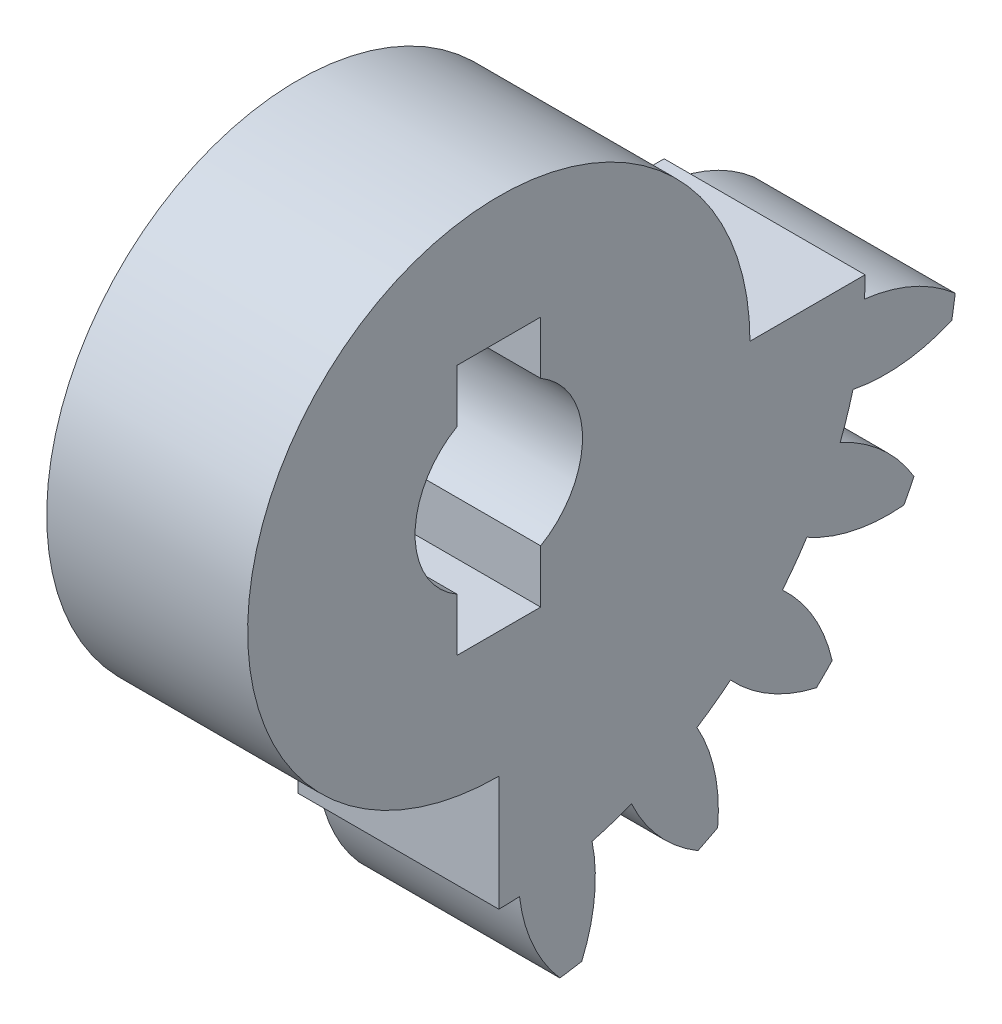
ISO-10303-21;
HEADER;
FILE_DESCRIPTION(('STEP AP214'),'2;1');
FILE_NAME('part.step','',(''),(''),'','','');
FILE_SCHEMA(('AUTOMOTIVE_DESIGN { 1 0 10303 214 1 1 1 1 }'));
ENDSEC;
DATA;
#1=APPLICATION_CONTEXT('core data for automotive mechanical design processes');
#2=APPLICATION_PROTOCOL_DEFINITION('international standard','automotive_design',2000,#1);
#3=PRODUCT_CONTEXT('',#1,'mechanical');
#4=PRODUCT('Part','Part','',(#3));
#5=PRODUCT_RELATED_PRODUCT_CATEGORY('part','',(#4));
#6=PRODUCT_DEFINITION_FORMATION('','',#4);
#7=PRODUCT_DEFINITION_CONTEXT('part definition',#1,'design');
#8=PRODUCT_DEFINITION('design','',#6,#7);
#9=PRODUCT_DEFINITION_SHAPE('','',#8);
#10=(LENGTH_UNIT() NAMED_UNIT(*) SI_UNIT(.MILLI.,.METRE.));
#11=(NAMED_UNIT(*) PLANE_ANGLE_UNIT() SI_UNIT($,.RADIAN.));
#12=(NAMED_UNIT(*) SI_UNIT($,.STERADIAN.) SOLID_ANGLE_UNIT());
#13=UNCERTAINTY_MEASURE_WITH_UNIT(LENGTH_MEASURE(1.E-05),#10,'distance_accuracy_value','');
#14=(GEOMETRIC_REPRESENTATION_CONTEXT(3) GLOBAL_UNCERTAINTY_ASSIGNED_CONTEXT((#13)) GLOBAL_UNIT_ASSIGNED_CONTEXT((#10,
#11,#12)) REPRESENTATION_CONTEXT('',''));
#15=CARTESIAN_POINT('',(0.,0.,0.));
#16=DIRECTION('',(0.,0.,1.));
#17=DIRECTION('',(1.,0.,0.));
#18=AXIS2_PLACEMENT_3D('',#15,#16,#17);
#19=CARTESIAN_POINT('',(-10.,0.,0.));
#20=DIRECTION('',(1.,0.,0.));
#21=DIRECTION('',(0.,0.,-1.));
#22=AXIS2_PLACEMENT_3D('',#19,#20,#21);
#23=CYLINDRICAL_SURFACE('',#22,5.);
#24=CARTESIAN_POINT('',(12.,0.,0.));
#25=DIRECTION('',(1.,0.,0.));
#26=DIRECTION('',(0.,0.,-1.));
#27=AXIS2_PLACEMENT_3D('',#24,#25,#26);
#28=CIRCLE('',#27,5.);
#29=CARTESIAN_POINT('',(12.,-4.33012701892219,-2.5));
#30=VERTEX_POINT('',#29);
#31=CARTESIAN_POINT('',(12.,4.33012701892219,-2.5));
#32=VERTEX_POINT('',#31);
#33=EDGE_CURVE('E268',#30,#32,#28,.T.);
#34=ORIENTED_EDGE('',*,*,#33,.T.);
#35=DIRECTION('',(1.,0.,0.));
#36=VECTOR('',#35,1.);
#37=CARTESIAN_POINT('',(-10.,4.33012701892219,-2.5));
#38=LINE('',#37,#36);
#39=CARTESIAN_POINT('',(0.,4.33012701892219,-2.5));
#40=VERTEX_POINT('',#39);
#41=EDGE_CURVE('E269',#32,#40,#38,.F.);
#42=ORIENTED_EDGE('',*,*,#41,.T.);
#43=CARTESIAN_POINT('',(0.,0.,0.));
#44=DIRECTION('',(1.,0.,0.));
#45=DIRECTION('',(0.,0.,-1.));
#46=AXIS2_PLACEMENT_3D('',#43,#44,#45);
#47=CIRCLE('',#46,5.);
#48=CARTESIAN_POINT('',(0.,-4.33012701892219,-2.5));
#49=VERTEX_POINT('',#48);
#50=EDGE_CURVE('E284',#49,#40,#47,.T.);
#51=ORIENTED_EDGE('',*,*,#50,.F.);
#52=DIRECTION('',(1.,0.,0.));
#53=VECTOR('',#52,1.);
#54=CARTESIAN_POINT('',(-10.,-4.33012701892219,-2.5));
#55=LINE('',#54,#53);
#56=EDGE_CURVE('E272',#49,#30,#55,.T.);
#57=ORIENTED_EDGE('',*,*,#56,.T.);
#58=EDGE_LOOP('',(#34,#42,#51,#57));
#59=FACE_BOUND('',#58,.T.);
#60=ADVANCED_FACE('F38',(#59),#23,.F.);
#61=CARTESIAN_POINT('',(12.,0.,0.));
#62=DIRECTION('',(-1.,0.,0.));
#63=DIRECTION('',(0.,0.,1.));
#64=AXIS2_PLACEMENT_3D('',#61,#62,#63);
#65=PLANE('',#64);
#66=DIRECTION('',(0.,0.,-1.));
#67=VECTOR('',#66,1.);
#68=CARTESIAN_POINT('',(12.,7.5,0.));
#69=LINE('',#68,#67);
#70=CARTESIAN_POINT('',(12.,7.5,2.5));
#71=VERTEX_POINT('',#70);
#72=CARTESIAN_POINT('',(12.,7.5,-2.5));
#73=VERTEX_POINT('',#72);
#74=EDGE_CURVE('E275',#71,#73,#69,.T.);
#75=ORIENTED_EDGE('',*,*,#74,.T.);
#76=DIRECTION('',(0.,-1.,0.));
#77=VECTOR('',#76,1.);
#78=CARTESIAN_POINT('',(12.,0.,-2.5));
#79=LINE('',#78,#77);
#80=EDGE_CURVE('E417',#73,#32,#79,.T.);
#81=ORIENTED_EDGE('',*,*,#80,.T.);
#82=ORIENTED_EDGE('',*,*,#33,.F.);
#83=CARTESIAN_POINT('',(12.,-7.5,-2.5));
#84=VERTEX_POINT('',#83);
#85=EDGE_CURVE('E422',#30,#84,#79,.T.);
#86=ORIENTED_EDGE('',*,*,#85,.T.);
#87=DIRECTION('',(0.,0.,1.));
#88=VECTOR('',#87,1.);
#89=CARTESIAN_POINT('',(12.,-7.5,0.));
#90=LINE('',#89,#88);
#91=CARTESIAN_POINT('',(12.,-7.5,2.5));
#92=VERTEX_POINT('',#91);
#93=EDGE_CURVE('E418',#84,#92,#90,.T.);
#94=ORIENTED_EDGE('',*,*,#93,.T.);
#95=DIRECTION('',(0.,1.,0.));
#96=VECTOR('',#95,1.);
#97=CARTESIAN_POINT('',(12.,0.,2.5));
#98=LINE('',#97,#96);
#99=CARTESIAN_POINT('',(12.,-4.33012701892219,2.5));
#100=VERTEX_POINT('',#99);
#101=EDGE_CURVE('E421',#92,#100,#98,.T.);
#102=ORIENTED_EDGE('',*,*,#101,.T.);
#103=CARTESIAN_POINT('',(12.,4.33012701892219,2.5));
#104=VERTEX_POINT('',#103);
#105=EDGE_CURVE('E280',#104,#100,#28,.T.);
#106=ORIENTED_EDGE('',*,*,#105,.F.);
#107=EDGE_CURVE('E425',#104,#71,#98,.T.);
#108=ORIENTED_EDGE('',*,*,#107,.T.);
#109=EDGE_LOOP('',(#75,#81,#82,#86,#94,#102,#106,#108));
#110=FACE_BOUND('',#109,.T.);
#111=DIRECTION('',(0.,0.,1.));
#112=VECTOR('',#111,1.);
#113=CARTESIAN_POINT('',(12.,0.,0.));
#114=LINE('',#113,#112);
#115=CARTESIAN_POINT('',(12.,0.,-21.874));
#116=VERTEX_POINT('',#115);
#117=CARTESIAN_POINT('',(12.,0.,-15.));
#118=VERTEX_POINT('',#117);
#119=EDGE_CURVE('E253',#116,#118,#114,.T.);
#120=ORIENTED_EDGE('',*,*,#119,.T.);
#121=CARTESIAN_POINT('',(12.,0.,0.));
#122=DIRECTION('',(-1.,0.,0.));
#123=DIRECTION('',(0.,0.,1.));
#124=AXIS2_PLACEMENT_3D('',#121,#122,#123);
#125=CIRCLE('',#124,15.);
#126=CARTESIAN_POINT('',(12.,-15.,0.));
#127=VERTEX_POINT('',#126);
#128=EDGE_CURVE('E252',#118,#127,#125,.F.);
#129=ORIENTED_EDGE('',*,*,#128,.T.);
#130=DIRECTION('',(0.,-1.,0.));
#131=VECTOR('',#130,1.);
#132=CARTESIAN_POINT('',(12.,0.,0.));
#133=LINE('',#132,#131);
#134=CARTESIAN_POINT('',(12.,-21.874,0.));
#135=VERTEX_POINT('',#134);
#136=EDGE_CURVE('E428',#127,#135,#133,.T.);
#137=ORIENTED_EDGE('',*,*,#136,.T.);
#138=CARTESIAN_POINT('',(12.,0.,0.));
#139=DIRECTION('',(-1.,0.,0.));
#140=DIRECTION('',(0.,0.,1.));
#141=AXIS2_PLACEMENT_3D('',#138,#139,#140);
#142=CIRCLE('',#141,21.874);
#143=CARTESIAN_POINT('',(12.,-21.8389540079858,-1.23772526720575));
#144=VERTEX_POINT('',#143);
#145=EDGE_CURVE('E409',#144,#135,#142,.T.);
#146=ORIENTED_EDGE('',*,*,#145,.F.);
#147=CARTESIAN_POINT('',(12.,-20.6674910859764,-11.168871959424));
#148=DIRECTION('',(-1.,0.,0.));
#149=DIRECTION('',(0.,0.,1.));
#150=AXIS2_PLACEMENT_3D('',#147,#148,#149);
#151=CIRCLE('',#150,10.);
#152=CARTESIAN_POINT('',(12.,-27.2570862348367,-3.64708787756433));
#153=VERTEX_POINT('',#152);
#154=EDGE_CURVE('E310',#153,#144,#151,.T.);
#155=ORIENTED_EDGE('',*,*,#154,.F.);
#156=CARTESIAN_POINT('',(12.,0.,0.));
#157=DIRECTION('',(-1.,0.,0.));
#158=DIRECTION('',(0.,0.,1.));
#159=AXIS2_PLACEMENT_3D('',#156,#157,#158);
#160=CIRCLE('',#159,27.5);
#161=CARTESIAN_POINT('',(12.,-27.0500416130065,-4.95431617224976));
#162=VERTEX_POINT('',#161);
#163=EDGE_CURVE('E450',#162,#153,#160,.T.);
#164=ORIENTED_EDGE('',*,*,#163,.F.);
#165=CARTESIAN_POINT('',(12.,-23.1073233162498,4.23562248001661));
#166=DIRECTION('',(-1.,0.,0.));
#167=DIRECTION('',(0.,-0.309016994374955,0.951056516295151));
#168=AXIS2_PLACEMENT_3D('',#165,#166,#167);
#169=CIRCLE('',#168,10.);
#170=CARTESIAN_POINT('',(12.,-21.1525576602989,-5.57146124708161));
#171=VERTEX_POINT('',#170);
#172=EDGE_CURVE('E328',#171,#162,#169,.T.);
#173=ORIENTED_EDGE('',*,*,#172,.F.);
#174=CARTESIAN_POINT('',(12.,0.,0.));
#175=DIRECTION('',(-1.,0.,0.));
#176=DIRECTION('',(0.,-0.309016994374955,0.951056516295151));
#177=AXIS2_PLACEMENT_3D('',#174,#175,#176);
#178=CIRCLE('',#177,21.874);
#179=CARTESIAN_POINT('',(12.,-20.3876013764312,-7.9257546085997));
#180=VERTEX_POINT('',#179);
#181=EDGE_CURVE('E302',#180,#171,#178,.T.);
#182=ORIENTED_EDGE('',*,*,#181,.F.);
#183=CARTESIAN_POINT('',(12.,-16.20458082933,-17.0088344333359));
#184=DIRECTION('',(-1.,0.,0.));
#185=DIRECTION('',(0.,-0.309016994374955,0.951056516295151));
#186=AXIS2_PLACEMENT_3D('',#183,#184,#185);
#187=CIRCLE('',#186,10.);
#188=CARTESIAN_POINT('',(12.,-24.7960173447141,-11.8914895551666));
#189=VERTEX_POINT('',#188);
#190=EDGE_CURVE('E332',#189,#180,#187,.T.);
#191=ORIENTED_EDGE('',*,*,#190,.F.);
#192=CARTESIAN_POINT('',(12.,-24.1951504493731,-13.0707572363732));
#193=VERTEX_POINT('',#192);
#194=EDGE_CURVE('E288',#193,#189,#160,.T.);
#195=ORIENTED_EDGE('',*,*,#194,.F.);
#196=CARTESIAN_POINT('',(12.,-23.28524974214,-3.11223923905164));
#197=DIRECTION('',(-1.,0.,0.));
#198=DIRECTION('',(0.,-0.58778525229248,0.809016994374942));
#199=AXIS2_PLACEMENT_3D('',#196,#197,#198);
#200=CIRCLE('',#199,10.);
#201=CARTESIAN_POINT('',(12.,-18.3956015902865,-11.8352743158512));
#202=VERTEX_POINT('',#201);
#203=EDGE_CURVE('E335',#202,#193,#200,.T.);
#204=ORIENTED_EDGE('',*,*,#203,.F.);
#205=CARTESIAN_POINT('',(12.,0.,0.));
#206=DIRECTION('',(-1.,0.,0.));
#207=DIRECTION('',(0.,-0.58778525229248,0.809016994374942));
#208=AXIS2_PLACEMENT_3D('',#205,#206,#207);
#209=CIRCLE('',#208,21.874);
#210=CARTESIAN_POINT('',(12.,-16.9405682733801,-13.8379558669244));
#211=VERTEX_POINT('',#210);
#212=EDGE_CURVE('E306',#211,#202,#209,.T.);
#213=ORIENTED_EDGE('',*,*,#212,.F.);
#214=CARTESIAN_POINT('',(12.,-10.1554532971553,-21.1838536853949));
#215=DIRECTION('',(-1.,0.,0.));
#216=DIRECTION('',(0.,-0.58778525229248,0.809016994374942));
#217=AXIS2_PLACEMENT_3D('',#214,#215,#216);
#218=CIRCLE('',#217,10.);
#219=CARTESIAN_POINT('',(12.,-19.9077415128793,-18.9718693822296));
#220=VERTEX_POINT('',#219);
#221=EDGE_CURVE('E339',#220,#211,#218,.T.);
#222=ORIENTED_EDGE('',*,*,#221,.F.);
#223=CARTESIAN_POINT('',(12.,-18.9718693822293,-19.9077415128797));
#224=VERTEX_POINT('',#223);
#225=EDGE_CURVE('E456',#224,#220,#160,.T.);
#226=ORIENTED_EDGE('',*,*,#225,.F.);
#227=CARTESIAN_POINT('',(12.,-21.1838536853947,-10.1554532971557));
#228=DIRECTION('',(-1.,0.,0.));
#229=DIRECTION('',(0.,-0.809016994374953,0.587785252292465));
#230=AXIS2_PLACEMENT_3D('',#227,#228,#229);
#231=CIRCLE('',#230,10.);
#232=CARTESIAN_POINT('',(12.,-13.8379558669241,-16.9405682733803));
#233=VERTEX_POINT('',#232);
#234=EDGE_CURVE('E314',#233,#224,#231,.T.);
#235=ORIENTED_EDGE('',*,*,#234,.F.);
#236=CARTESIAN_POINT('',(12.,0.,0.));
#237=DIRECTION('',(-1.,0.,0.));
#238=DIRECTION('',(0.,-0.809016994374953,0.587785252292465));
#239=AXIS2_PLACEMENT_3D('',#236,#237,#238);
#240=CIRCLE('',#239,21.874);
#241=CARTESIAN_POINT('',(12.,-11.8352743158509,-18.3956015902867));
#242=VERTEX_POINT('',#241);
#243=EDGE_CURVE('E294',#242,#233,#240,.T.);
#244=ORIENTED_EDGE('',*,*,#243,.F.);
#245=CARTESIAN_POINT('',(12.,-3.11223923905121,-23.28524974214));
#246=DIRECTION('',(-1.,0.,0.));
#247=DIRECTION('',(0.,-0.809016994374953,0.587785252292465));
#248=AXIS2_PLACEMENT_3D('',#245,#246,#247);
#249=CIRCLE('',#248,10.);
#250=CARTESIAN_POINT('',(12.,-13.0707572363727,-24.1951504493733));
#251=VERTEX_POINT('',#250);
#252=EDGE_CURVE('E318',#251,#242,#249,.T.);
#253=ORIENTED_EDGE('',*,*,#252,.F.);
#254=CARTESIAN_POINT('',(12.,-11.8914895551662,-24.7960173447143));
#255=VERTEX_POINT('',#254);
#256=EDGE_CURVE('E463',#255,#251,#160,.T.);
#257=ORIENTED_EDGE('',*,*,#256,.F.);
#258=CARTESIAN_POINT('',(12.,-17.0088344333356,-16.2045808293303));
#259=DIRECTION('',(-1.,0.,0.));
#260=DIRECTION('',(0.,-0.951056516295157,0.309016994374938));
#261=AXIS2_PLACEMENT_3D('',#258,#259,#260);
#262=CIRCLE('',#261,10.);
#263=CARTESIAN_POINT('',(12.,-7.92575460859934,-20.3876013764314));
#264=VERTEX_POINT('',#263);
#265=EDGE_CURVE('E321',#264,#255,#262,.T.);
#266=ORIENTED_EDGE('',*,*,#265,.F.);
#267=CARTESIAN_POINT('',(12.,0.,0.));
#268=DIRECTION('',(-1.,0.,0.));
#269=DIRECTION('',(0.,-0.951056516295157,0.309016994374938));
#270=AXIS2_PLACEMENT_3D('',#267,#268,#269);
#271=CIRCLE('',#270,21.874);
#272=CARTESIAN_POINT('',(12.,-5.57146124708125,-21.1525576602989));
#273=VERTEX_POINT('',#272);
#274=EDGE_CURVE('E298',#273,#264,#271,.T.);
#275=ORIENTED_EDGE('',*,*,#274,.F.);
#276=CARTESIAN_POINT('',(12.,4.23562248001701,-23.1073233162497));
#277=DIRECTION('',(-1.,0.,0.));
#278=DIRECTION('',(0.,-0.951056516295157,0.309016994374938));
#279=AXIS2_PLACEMENT_3D('',#276,#277,#278);
#280=CIRCLE('',#279,10.);
#281=CARTESIAN_POINT('',(12.,-4.95431617224929,-27.0500416130066));
#282=VERTEX_POINT('',#281);
#283=EDGE_CURVE('E325',#282,#273,#280,.T.);
#284=ORIENTED_EDGE('',*,*,#283,.F.);
#285=CARTESIAN_POINT('',(12.,-3.64708787756386,-27.2570862348368));
#286=VERTEX_POINT('',#285);
#287=EDGE_CURVE('E457',#286,#282,#160,.T.);
#288=ORIENTED_EDGE('',*,*,#287,.F.);
#289=CARTESIAN_POINT('',(12.,-11.1688719594236,-20.6674910859766));
#290=DIRECTION('',(-1.,0.,0.));
#291=DIRECTION('',(0.,-1.,0.));
#292=AXIS2_PLACEMENT_3D('',#289,#290,#291);
#293=CIRCLE('',#292,10.);
#294=CARTESIAN_POINT('',(12.,-1.23772526720537,-21.8389540079858));
#295=VERTEX_POINT('',#294);
#296=EDGE_CURVE('E342',#295,#286,#293,.T.);
#297=ORIENTED_EDGE('',*,*,#296,.F.);
#298=CARTESIAN_POINT('',(12.,0.,0.));
#299=DIRECTION('',(-1.,0.,0.));
#300=DIRECTION('',(0.,-1.,0.));
#301=AXIS2_PLACEMENT_3D('',#298,#299,#300);
#302=CIRCLE('',#301,21.874);
#303=EDGE_CURVE('E346',#116,#295,#302,.T.);
#304=ORIENTED_EDGE('',*,*,#303,.F.);
#305=EDGE_LOOP('',(#120,#129,#137,#146,#155,#164,#173,#182,#191,#195,#204,#213,#222,#226,#235,
#244,#253,#257,#266,#275,#284,#288,#297,#304));
#306=FACE_BOUND('',#305,.T.);
#307=ADVANCED_FACE('F40',(#110,#306),#65,.F.);
#308=CARTESIAN_POINT('',(-10.,0.,0.));
#309=DIRECTION('',(-1.,0.,0.));
#310=DIRECTION('',(0.,0.,1.));
#311=AXIS2_PLACEMENT_3D('',#308,#309,#310);
#312=CYLINDRICAL_SURFACE('',#311,27.5);
#313=DIRECTION('',(-1.,0.,0.));
#314=VECTOR('',#313,1.);
#315=CARTESIAN_POINT('',(6.,-27.2570862348367,-3.64708787756434));
#316=LINE('',#315,#314);
#317=CARTESIAN_POINT('',(0.,-27.2570862348367,-3.64708787756434));
#318=VERTEX_POINT('',#317);
#319=EDGE_CURVE('E308',#318,#153,#316,.F.);
#320=ORIENTED_EDGE('',*,*,#319,.F.);
#321=CARTESIAN_POINT('',(0.,0.,0.));
#322=DIRECTION('',(-1.,0.,0.));
#323=DIRECTION('',(0.,0.,1.));
#324=AXIS2_PLACEMENT_3D('',#321,#322,#323);
#325=CIRCLE('',#324,27.5);
#326=CARTESIAN_POINT('',(0.,-27.0500416130065,-4.95431617224976));
#327=VERTEX_POINT('',#326);
#328=EDGE_CURVE('E343',#327,#318,#325,.T.);
#329=ORIENTED_EDGE('',*,*,#328,.F.);
#330=DIRECTION('',(-1.,0.,0.));
#331=VECTOR('',#330,1.);
#332=CARTESIAN_POINT('',(6.,-27.0500416130065,-4.95431617224976));
#333=LINE('',#332,#331);
#334=EDGE_CURVE('E326',#162,#327,#333,.T.);
#335=ORIENTED_EDGE('',*,*,#334,.F.);
#336=ORIENTED_EDGE('',*,*,#163,.T.);
#337=EDGE_LOOP('',(#320,#329,#335,#336));
#338=FACE_BOUND('',#337,.T.);
#339=ADVANCED_FACE('F519',(#338),#312,.T.);
#340=DIRECTION('',(-1.,0.,0.));
#341=VECTOR('',#340,1.);
#342=CARTESIAN_POINT('',(6.,-18.9718693822293,-19.9077415128797));
#343=LINE('',#342,#341);
#344=CARTESIAN_POINT('',(0.,-18.9718693822293,-19.9077415128797));
#345=VERTEX_POINT('',#344);
#346=EDGE_CURVE('E312',#224,#345,#343,.T.);
#347=ORIENTED_EDGE('',*,*,#346,.F.);
#348=ORIENTED_EDGE('',*,*,#225,.T.);
#349=DIRECTION('',(-1.,0.,0.));
#350=VECTOR('',#349,1.);
#351=CARTESIAN_POINT('',(6.,-19.9077415128793,-18.9718693822296));
#352=LINE('',#351,#350);
#353=CARTESIAN_POINT('',(0.,-19.9077415128793,-18.9718693822296));
#354=VERTEX_POINT('',#353);
#355=EDGE_CURVE('E337',#354,#220,#352,.F.);
#356=ORIENTED_EDGE('',*,*,#355,.F.);
#357=EDGE_CURVE('E376',#345,#354,#325,.T.);
#358=ORIENTED_EDGE('',*,*,#357,.F.);
#359=EDGE_LOOP('',(#347,#348,#356,#358));
#360=FACE_BOUND('',#359,.T.);
#361=ADVANCED_FACE('F567',(#360),#312,.T.);
#362=DIRECTION('',(-1.,0.,0.));
#363=VECTOR('',#362,1.);
#364=CARTESIAN_POINT('',(6.,-13.0707572363727,-24.1951504493733));
#365=LINE('',#364,#363);
#366=CARTESIAN_POINT('',(0.,-13.0707572363727,-24.1951504493733));
#367=VERTEX_POINT('',#366);
#368=EDGE_CURVE('E316',#367,#251,#365,.F.);
#369=ORIENTED_EDGE('',*,*,#368,.F.);
#370=CARTESIAN_POINT('',(0.,-11.8914895551662,-24.7960173447143));
#371=VERTEX_POINT('',#370);
#372=EDGE_CURVE('E389',#371,#367,#325,.T.);
#373=ORIENTED_EDGE('',*,*,#372,.F.);
#374=DIRECTION('',(-1.,0.,0.));
#375=VECTOR('',#374,1.);
#376=CARTESIAN_POINT('',(6.,-11.8914895551662,-24.7960173447143));
#377=LINE('',#376,#375);
#378=EDGE_CURVE('E319',#255,#371,#377,.T.);
#379=ORIENTED_EDGE('',*,*,#378,.F.);
#380=ORIENTED_EDGE('',*,*,#256,.T.);
#381=EDGE_LOOP('',(#369,#373,#379,#380));
#382=FACE_BOUND('',#381,.T.);
#383=ADVANCED_FACE('F475',(#382),#312,.T.);
#384=DIRECTION('',(-1.,0.,0.));
#385=VECTOR('',#384,1.);
#386=CARTESIAN_POINT('',(6.,-4.95431617224929,-27.0500416130066));
#387=LINE('',#386,#385);
#388=CARTESIAN_POINT('',(0.,-4.95431617224929,-27.0500416130066));
#389=VERTEX_POINT('',#388);
#390=EDGE_CURVE('E323',#389,#282,#387,.F.);
#391=ORIENTED_EDGE('',*,*,#390,.F.);
#392=CARTESIAN_POINT('',(0.,-3.64708787756386,-27.2570862348368));
#393=VERTEX_POINT('',#392);
#394=EDGE_CURVE('E353',#393,#389,#325,.T.);
#395=ORIENTED_EDGE('',*,*,#394,.F.);
#396=DIRECTION('',(-1.,0.,0.));
#397=VECTOR('',#396,1.);
#398=CARTESIAN_POINT('',(6.,-3.64708787756386,-27.2570862348368));
#399=LINE('',#398,#397);
#400=EDGE_CURVE('E340',#286,#393,#399,.T.);
#401=ORIENTED_EDGE('',*,*,#400,.F.);
#402=ORIENTED_EDGE('',*,*,#287,.T.);
#403=EDGE_LOOP('',(#391,#395,#401,#402));
#404=FACE_BOUND('',#403,.T.);
#405=ADVANCED_FACE('F578',(#404),#312,.T.);
#406=DIRECTION('',(-1.,0.,0.));
#407=VECTOR('',#406,1.);
#408=CARTESIAN_POINT('',(6.,-24.7960173447141,-11.8914895551666));
#409=LINE('',#408,#407);
#410=CARTESIAN_POINT('',(0.,-24.7960173447141,-11.8914895551666));
#411=VERTEX_POINT('',#410);
#412=EDGE_CURVE('E330',#411,#189,#409,.F.);
#413=ORIENTED_EDGE('',*,*,#412,.F.);
#414=CARTESIAN_POINT('',(0.,-24.1951504493731,-13.0707572363732));
#415=VERTEX_POINT('',#414);
#416=EDGE_CURVE('E363',#415,#411,#325,.T.);
#417=ORIENTED_EDGE('',*,*,#416,.F.);
#418=DIRECTION('',(-1.,0.,0.));
#419=VECTOR('',#418,1.);
#420=CARTESIAN_POINT('',(6.,-24.1951504493731,-13.0707572363732));
#421=LINE('',#420,#419);
#422=EDGE_CURVE('E333',#193,#415,#421,.T.);
#423=ORIENTED_EDGE('',*,*,#422,.F.);
#424=ORIENTED_EDGE('',*,*,#194,.T.);
#425=EDGE_LOOP('',(#413,#417,#423,#424));
#426=FACE_BOUND('',#425,.T.);
#427=ADVANCED_FACE('F502',(#426),#312,.T.);
#428=CARTESIAN_POINT('',(0.,0.,0.));
#429=DIRECTION('',(1.,0.,0.));
#430=DIRECTION('',(0.,0.,-1.));
#431=AXIS2_PLACEMENT_3D('',#428,#429,#430);
#432=PLANE('',#431);
#433=ORIENTED_EDGE('',*,*,#50,.T.);
#434=DIRECTION('',(0.,-1.,0.));
#435=VECTOR('',#434,1.);
#436=CARTESIAN_POINT('',(0.,-7.5,-2.5));
#437=LINE('',#436,#435);
#438=CARTESIAN_POINT('',(0.,7.5,-2.5));
#439=VERTEX_POINT('',#438);
#440=EDGE_CURVE('E441',#439,#40,#437,.T.);
#441=ORIENTED_EDGE('',*,*,#440,.F.);
#442=DIRECTION('',(0.,0.,-1.));
#443=VECTOR('',#442,1.);
#444=CARTESIAN_POINT('',(0.,7.5,2.5));
#445=LINE('',#444,#443);
#446=CARTESIAN_POINT('',(0.,7.5,2.5));
#447=VERTEX_POINT('',#446);
#448=EDGE_CURVE('E432',#447,#439,#445,.T.);
#449=ORIENTED_EDGE('',*,*,#448,.F.);
#450=DIRECTION('',(0.,1.,0.));
#451=VECTOR('',#450,1.);
#452=CARTESIAN_POINT('',(0.,-7.5,2.5));
#453=LINE('',#452,#451);
#454=CARTESIAN_POINT('',(0.,4.33012701892219,2.5));
#455=VERTEX_POINT('',#454);
#456=EDGE_CURVE('E439',#455,#447,#453,.T.);
#457=ORIENTED_EDGE('',*,*,#456,.F.);
#458=CARTESIAN_POINT('',(0.,-4.33012701892219,2.5));
#459=VERTEX_POINT('',#458);
#460=EDGE_CURVE('E287',#455,#459,#47,.T.);
#461=ORIENTED_EDGE('',*,*,#460,.T.);
#462=CARTESIAN_POINT('',(0.,-7.5,2.5));
#463=VERTEX_POINT('',#462);
#464=EDGE_CURVE('E435',#463,#459,#453,.T.);
#465=ORIENTED_EDGE('',*,*,#464,.F.);
#466=DIRECTION('',(0.,0.,1.));
#467=VECTOR('',#466,1.);
#468=CARTESIAN_POINT('',(0.,-7.5,2.5));
#469=LINE('',#468,#467);
#470=CARTESIAN_POINT('',(0.,-7.5,-2.5));
#471=VERTEX_POINT('',#470);
#472=EDGE_CURVE('E431',#471,#463,#469,.T.);
#473=ORIENTED_EDGE('',*,*,#472,.F.);
#474=EDGE_CURVE('E436',#49,#471,#437,.T.);
#475=ORIENTED_EDGE('',*,*,#474,.F.);
#476=EDGE_LOOP('',(#433,#441,#449,#457,#461,#465,#473,#475));
#477=FACE_BOUND('',#476,.T.);
#478=CARTESIAN_POINT('',(0.,0.,0.));
#479=DIRECTION('',(1.,0.,0.));
#480=DIRECTION('',(0.,0.,1.));
#481=AXIS2_PLACEMENT_3D('',#478,#479,#480);
#482=CIRCLE('',#481,15.);
#483=CARTESIAN_POINT('',(0.,0.,-15.));
#484=VERTEX_POINT('',#483);
#485=CARTESIAN_POINT('',(0.,-15.,0.));
#486=VERTEX_POINT('',#485);
#487=EDGE_CURVE('E243',#484,#486,#482,.T.);
#488=ORIENTED_EDGE('',*,*,#487,.F.);
#489=DIRECTION('',(0.,0.,1.));
#490=VECTOR('',#489,1.);
#491=CARTESIAN_POINT('',(0.,0.,-15.));
#492=LINE('',#491,#490);
#493=CARTESIAN_POINT('',(0.,0.,-21.874));
#494=VERTEX_POINT('',#493);
#495=EDGE_CURVE('E247',#494,#484,#492,.T.);
#496=ORIENTED_EDGE('',*,*,#495,.F.);
#497=CARTESIAN_POINT('',(0.,0.,0.));
#498=DIRECTION('',(-1.,0.,0.));
#499=DIRECTION('',(0.,-1.,0.));
#500=AXIS2_PLACEMENT_3D('',#497,#498,#499);
#501=CIRCLE('',#500,21.874);
#502=CARTESIAN_POINT('',(0.,-1.23772526720537,-21.8389540079858));
#503=VERTEX_POINT('',#502);
#504=EDGE_CURVE('E347',#494,#503,#501,.T.);
#505=ORIENTED_EDGE('',*,*,#504,.T.);
#506=CARTESIAN_POINT('',(0.,-11.1688719594236,-20.6674910859766));
#507=DIRECTION('',(-1.,0.,0.));
#508=DIRECTION('',(0.,-1.,0.));
#509=AXIS2_PLACEMENT_3D('',#506,#507,#508);
#510=CIRCLE('',#509,10.);
#511=EDGE_CURVE('E349',#503,#393,#510,.T.);
#512=ORIENTED_EDGE('',*,*,#511,.T.);
#513=ORIENTED_EDGE('',*,*,#394,.T.);
#514=CARTESIAN_POINT('',(0.,4.23562248001701,-23.1073233162497));
#515=DIRECTION('',(1.,0.,0.));
#516=DIRECTION('',(0.,0.,-1.));
#517=AXIS2_PLACEMENT_3D('',#514,#515,#516);
#518=CIRCLE('',#517,10.);
#519=CARTESIAN_POINT('',(0.,-5.57146124708125,-21.1525576602989));
#520=VERTEX_POINT('',#519);
#521=EDGE_CURVE('E296',#520,#389,#518,.T.);
#522=ORIENTED_EDGE('',*,*,#521,.F.);
#523=CARTESIAN_POINT('',(0.,0.,0.));
#524=DIRECTION('',(-1.,0.,0.));
#525=DIRECTION('',(0.,-0.951056516295157,0.309016994374938));
#526=AXIS2_PLACEMENT_3D('',#523,#524,#525);
#527=CIRCLE('',#526,21.874);
#528=CARTESIAN_POINT('',(0.,-7.92575460859934,-20.3876013764314));
#529=VERTEX_POINT('',#528);
#530=EDGE_CURVE('E398',#520,#529,#527,.T.);
#531=ORIENTED_EDGE('',*,*,#530,.T.);
#532=CARTESIAN_POINT('',(0.,-17.0088344333356,-16.2045808293303));
#533=DIRECTION('',(-1.,0.,0.));
#534=DIRECTION('',(0.,-0.951056516295157,0.309016994374938));
#535=AXIS2_PLACEMENT_3D('',#532,#533,#534);
#536=CIRCLE('',#535,10.);
#537=EDGE_CURVE('E401',#529,#371,#536,.T.);
#538=ORIENTED_EDGE('',*,*,#537,.T.);
#539=ORIENTED_EDGE('',*,*,#372,.T.);
#540=CARTESIAN_POINT('',(0.,-3.11223923905121,-23.28524974214));
#541=DIRECTION('',(1.,0.,0.));
#542=DIRECTION('',(0.,0.,-1.));
#543=AXIS2_PLACEMENT_3D('',#540,#541,#542);
#544=CIRCLE('',#543,10.);
#545=CARTESIAN_POINT('',(0.,-11.8352743158509,-18.3956015902867));
#546=VERTEX_POINT('',#545);
#547=EDGE_CURVE('E292',#546,#367,#544,.T.);
#548=ORIENTED_EDGE('',*,*,#547,.F.);
#549=CARTESIAN_POINT('',(0.,0.,0.));
#550=DIRECTION('',(-1.,0.,0.));
#551=DIRECTION('',(0.,-0.809016994374953,0.587785252292465));
#552=AXIS2_PLACEMENT_3D('',#549,#550,#551);
#553=CIRCLE('',#552,21.874);
#554=CARTESIAN_POINT('',(0.,-13.8379558669241,-16.9405682733803));
#555=VERTEX_POINT('',#554);
#556=EDGE_CURVE('E385',#546,#555,#553,.T.);
#557=ORIENTED_EDGE('',*,*,#556,.T.);
#558=CARTESIAN_POINT('',(0.,-21.1838536853947,-10.1554532971557));
#559=DIRECTION('',(-1.,0.,0.));
#560=DIRECTION('',(0.,-0.809016994374953,0.587785252292465));
#561=AXIS2_PLACEMENT_3D('',#558,#559,#560);
#562=CIRCLE('',#561,10.);
#563=EDGE_CURVE('E388',#555,#345,#562,.T.);
#564=ORIENTED_EDGE('',*,*,#563,.T.);
#565=ORIENTED_EDGE('',*,*,#357,.T.);
#566=CARTESIAN_POINT('',(0.,-10.1554532971553,-21.1838536853949));
#567=DIRECTION('',(1.,0.,0.));
#568=DIRECTION('',(0.,0.,-1.));
#569=AXIS2_PLACEMENT_3D('',#566,#567,#568);
#570=CIRCLE('',#569,10.);
#571=CARTESIAN_POINT('',(0.,-16.9405682733801,-13.8379558669244));
#572=VERTEX_POINT('',#571);
#573=EDGE_CURVE('E304',#572,#354,#570,.T.);
#574=ORIENTED_EDGE('',*,*,#573,.F.);
#575=CARTESIAN_POINT('',(0.,0.,0.));
#576=DIRECTION('',(-1.,0.,0.));
#577=DIRECTION('',(0.,-0.58778525229248,0.809016994374942));
#578=AXIS2_PLACEMENT_3D('',#575,#576,#577);
#579=CIRCLE('',#578,21.874);
#580=CARTESIAN_POINT('',(0.,-18.3956015902865,-11.8352743158512));
#581=VERTEX_POINT('',#580);
#582=EDGE_CURVE('E372',#572,#581,#579,.T.);
#583=ORIENTED_EDGE('',*,*,#582,.T.);
#584=CARTESIAN_POINT('',(0.,-23.28524974214,-3.11223923905164));
#585=DIRECTION('',(-1.,0.,0.));
#586=DIRECTION('',(0.,-0.58778525229248,0.809016994374942));
#587=AXIS2_PLACEMENT_3D('',#584,#585,#586);
#588=CIRCLE('',#587,10.);
#589=EDGE_CURVE('E375',#581,#415,#588,.T.);
#590=ORIENTED_EDGE('',*,*,#589,.T.);
#591=ORIENTED_EDGE('',*,*,#416,.T.);
#592=CARTESIAN_POINT('',(0.,-16.20458082933,-17.0088344333359));
#593=DIRECTION('',(1.,0.,0.));
#594=DIRECTION('',(0.,0.,-1.));
#595=AXIS2_PLACEMENT_3D('',#592,#593,#594);
#596=CIRCLE('',#595,10.);
#597=CARTESIAN_POINT('',(0.,-20.3876013764312,-7.9257546085997));
#598=VERTEX_POINT('',#597);
#599=EDGE_CURVE('E300',#598,#411,#596,.T.);
#600=ORIENTED_EDGE('',*,*,#599,.F.);
#601=CARTESIAN_POINT('',(0.,0.,0.));
#602=DIRECTION('',(-1.,0.,0.));
#603=DIRECTION('',(0.,-0.309016994374955,0.951056516295151));
#604=AXIS2_PLACEMENT_3D('',#601,#602,#603);
#605=CIRCLE('',#604,21.874);
#606=CARTESIAN_POINT('',(0.,-21.1525576602989,-5.57146124708161));
#607=VERTEX_POINT('',#606);
#608=EDGE_CURVE('E359',#598,#607,#605,.T.);
#609=ORIENTED_EDGE('',*,*,#608,.T.);
#610=CARTESIAN_POINT('',(0.,-23.1073233162498,4.23562248001661));
#611=DIRECTION('',(-1.,0.,0.));
#612=DIRECTION('',(0.,-0.309016994374955,0.951056516295151));
#613=AXIS2_PLACEMENT_3D('',#610,#611,#612);
#614=CIRCLE('',#613,10.);
#615=EDGE_CURVE('E362',#607,#327,#614,.T.);
#616=ORIENTED_EDGE('',*,*,#615,.T.);
#617=ORIENTED_EDGE('',*,*,#328,.T.);
#618=CARTESIAN_POINT('',(0.,-20.6674910859764,-11.168871959424));
#619=DIRECTION('',(1.,0.,0.));
#620=DIRECTION('',(0.,0.,-1.));
#621=AXIS2_PLACEMENT_3D('',#618,#619,#620);
#622=CIRCLE('',#621,10.);
#623=CARTESIAN_POINT('',(0.,-21.8389540079858,-1.23772526720575));
#624=VERTEX_POINT('',#623);
#625=EDGE_CURVE('E289',#624,#318,#622,.T.);
#626=ORIENTED_EDGE('',*,*,#625,.F.);
#627=CARTESIAN_POINT('',(0.,0.,0.));
#628=DIRECTION('',(-1.,0.,0.));
#629=DIRECTION('',(0.,0.,1.));
#630=AXIS2_PLACEMENT_3D('',#627,#628,#629);
#631=CIRCLE('',#630,21.874);
#632=CARTESIAN_POINT('',(0.,-21.874,0.));
#633=VERTEX_POINT('',#632);
#634=EDGE_CURVE('E350',#624,#633,#631,.T.);
#635=ORIENTED_EDGE('',*,*,#634,.T.);
#636=DIRECTION('',(0.,-1.,0.));
#637=VECTOR('',#636,1.);
#638=CARTESIAN_POINT('',(0.,0.,0.));
#639=LINE('',#638,#637);
#640=EDGE_CURVE('E47',#486,#633,#639,.T.);
#641=ORIENTED_EDGE('',*,*,#640,.F.);
#642=EDGE_LOOP('',(#488,#496,#505,#512,#513,#522,#531,#538,#539,#548,#557,#564,#565,#574,#583,
#590,#591,#600,#609,#616,#617,#626,#635,#641));
#643=FACE_BOUND('',#642,.T.);
#644=ADVANCED_FACE('F245',(#477,#643),#432,.F.);
#645=CARTESIAN_POINT('',(12.,-11.1688719594236,-20.6674910859766));
#646=DIRECTION('',(-1.,0.,0.));
#647=DIRECTION('',(0.,0.,1.));
#648=AXIS2_PLACEMENT_3D('',#645,#646,#647);
#649=CYLINDRICAL_SURFACE('',#648,10.);
#650=ORIENTED_EDGE('',*,*,#400,.T.);
#651=ORIENTED_EDGE('',*,*,#511,.F.);
#652=DIRECTION('',(-1.,0.,0.));
#653=VECTOR('',#652,1.);
#654=CARTESIAN_POINT('',(12.,-1.23772526720537,-21.8389540079858));
#655=LINE('',#654,#653);
#656=EDGE_CURVE('E336',#295,#503,#655,.T.);
#657=ORIENTED_EDGE('',*,*,#656,.F.);
#658=ORIENTED_EDGE('',*,*,#296,.T.);
#659=EDGE_LOOP('',(#650,#651,#657,#658));
#660=FACE_BOUND('',#659,.T.);
#661=ADVANCED_FACE('F569',(#660),#649,.T.);
#662=CARTESIAN_POINT('',(12.,0.,0.));
#663=DIRECTION('',(-1.,0.,0.));
#664=DIRECTION('',(0.,0.,1.));
#665=AXIS2_PLACEMENT_3D('',#662,#663,#664);
#666=CYLINDRICAL_SURFACE('',#665,21.874);
#667=DIRECTION('',(-1.,0.,0.));
#668=VECTOR('',#667,1.);
#669=CARTESIAN_POINT('',(12.,0.,-21.874));
#670=LINE('',#669,#668);
#671=EDGE_CURVE('E11',#116,#494,#670,.T.);
#672=ORIENTED_EDGE('',*,*,#671,.F.);
#673=ORIENTED_EDGE('',*,*,#303,.T.);
#674=ORIENTED_EDGE('',*,*,#656,.T.);
#675=ORIENTED_EDGE('',*,*,#504,.F.);
#676=EDGE_LOOP('',(#672,#673,#674,#675));
#677=FACE_BOUND('',#676,.T.);
#678=ADVANCED_FACE('F575',(#677),#666,.T.);
#679=CARTESIAN_POINT('',(12.,-23.28524974214,-3.11223923905164));
#680=DIRECTION('',(-1.,0.,0.));
#681=DIRECTION('',(0.,0.,1.));
#682=AXIS2_PLACEMENT_3D('',#679,#680,#681);
#683=CYLINDRICAL_SURFACE('',#682,10.);
#684=ORIENTED_EDGE('',*,*,#422,.T.);
#685=ORIENTED_EDGE('',*,*,#589,.F.);
#686=DIRECTION('',(-1.,0.,0.));
#687=VECTOR('',#686,1.);
#688=CARTESIAN_POINT('',(12.,-18.3956015902865,-11.8352743158512));
#689=LINE('',#688,#687);
#690=EDGE_CURVE('E329',#202,#581,#689,.T.);
#691=ORIENTED_EDGE('',*,*,#690,.F.);
#692=ORIENTED_EDGE('',*,*,#203,.T.);
#693=EDGE_LOOP('',(#684,#685,#691,#692));
#694=FACE_BOUND('',#693,.T.);
#695=ADVANCED_FACE('F767',(#694),#683,.T.);
#696=CARTESIAN_POINT('',(12.,-10.1554532971553,-21.1838536853949));
#697=DIRECTION('',(-1.,0.,0.));
#698=DIRECTION('',(0.,0.,1.));
#699=AXIS2_PLACEMENT_3D('',#696,#697,#698);
#700=CYLINDRICAL_SURFACE('',#699,10.);
#701=ORIENTED_EDGE('',*,*,#355,.T.);
#702=ORIENTED_EDGE('',*,*,#221,.T.);
#703=DIRECTION('',(-1.,0.,0.));
#704=VECTOR('',#703,1.);
#705=CARTESIAN_POINT('',(12.,-16.9405682733801,-13.8379558669244));
#706=LINE('',#705,#704);
#707=EDGE_CURVE('E307',#211,#572,#706,.T.);
#708=ORIENTED_EDGE('',*,*,#707,.T.);
#709=ORIENTED_EDGE('',*,*,#573,.T.);
#710=EDGE_LOOP('',(#701,#702,#708,#709));
#711=FACE_BOUND('',#710,.T.);
#712=ADVANCED_FACE('F758',(#711),#700,.T.);
#713=CARTESIAN_POINT('',(12.,0.,0.));
#714=DIRECTION('',(-1.,0.,0.));
#715=DIRECTION('',(0.,0.,1.));
#716=AXIS2_PLACEMENT_3D('',#713,#714,#715);
#717=CYLINDRICAL_SURFACE('',#716,21.874);
#718=ORIENTED_EDGE('',*,*,#582,.F.);
#719=ORIENTED_EDGE('',*,*,#707,.F.);
#720=ORIENTED_EDGE('',*,*,#212,.T.);
#721=ORIENTED_EDGE('',*,*,#690,.T.);
#722=EDGE_LOOP('',(#718,#719,#720,#721));
#723=FACE_BOUND('',#722,.T.);
#724=ADVANCED_FACE('F750',(#723),#717,.T.);
#725=CARTESIAN_POINT('',(12.,-23.1073233162498,4.23562248001661));
#726=DIRECTION('',(-1.,0.,0.));
#727=DIRECTION('',(0.,0.,1.));
#728=AXIS2_PLACEMENT_3D('',#725,#726,#727);
#729=CYLINDRICAL_SURFACE('',#728,10.);
#730=ORIENTED_EDGE('',*,*,#334,.T.);
#731=ORIENTED_EDGE('',*,*,#615,.F.);
#732=DIRECTION('',(-1.,0.,0.));
#733=VECTOR('',#732,1.);
#734=CARTESIAN_POINT('',(12.,-21.1525576602989,-5.57146124708161));
#735=LINE('',#734,#733);
#736=EDGE_CURVE('E322',#171,#607,#735,.T.);
#737=ORIENTED_EDGE('',*,*,#736,.F.);
#738=ORIENTED_EDGE('',*,*,#172,.T.);
#739=EDGE_LOOP('',(#730,#731,#737,#738));
#740=FACE_BOUND('',#739,.T.);
#741=ADVANCED_FACE('F516',(#740),#729,.T.);
#742=CARTESIAN_POINT('',(12.,-16.20458082933,-17.0088344333359));
#743=DIRECTION('',(-1.,0.,0.));
#744=DIRECTION('',(0.,0.,1.));
#745=AXIS2_PLACEMENT_3D('',#742,#743,#744);
#746=CYLINDRICAL_SURFACE('',#745,10.);
#747=ORIENTED_EDGE('',*,*,#412,.T.);
#748=ORIENTED_EDGE('',*,*,#190,.T.);
#749=DIRECTION('',(-1.,0.,0.));
#750=VECTOR('',#749,1.);
#751=CARTESIAN_POINT('',(12.,-20.3876013764312,-7.9257546085997));
#752=LINE('',#751,#750);
#753=EDGE_CURVE('E303',#180,#598,#752,.T.);
#754=ORIENTED_EDGE('',*,*,#753,.T.);
#755=ORIENTED_EDGE('',*,*,#599,.T.);
#756=EDGE_LOOP('',(#747,#748,#754,#755));
#757=FACE_BOUND('',#756,.T.);
#758=ADVANCED_FACE('F506',(#757),#746,.T.);
#759=CARTESIAN_POINT('',(12.,0.,0.));
#760=DIRECTION('',(-1.,0.,0.));
#761=DIRECTION('',(0.,0.,1.));
#762=AXIS2_PLACEMENT_3D('',#759,#760,#761);
#763=CYLINDRICAL_SURFACE('',#762,21.874);
#764=ORIENTED_EDGE('',*,*,#608,.F.);
#765=ORIENTED_EDGE('',*,*,#753,.F.);
#766=ORIENTED_EDGE('',*,*,#181,.T.);
#767=ORIENTED_EDGE('',*,*,#736,.T.);
#768=EDGE_LOOP('',(#764,#765,#766,#767));
#769=FACE_BOUND('',#768,.T.);
#770=ADVANCED_FACE('F514',(#769),#763,.T.);
#771=CARTESIAN_POINT('',(12.,-17.0088344333356,-16.2045808293303));
#772=DIRECTION('',(-1.,0.,0.));
#773=DIRECTION('',(0.,0.,1.));
#774=AXIS2_PLACEMENT_3D('',#771,#772,#773);
#775=CYLINDRICAL_SURFACE('',#774,10.);
#776=ORIENTED_EDGE('',*,*,#378,.T.);
#777=ORIENTED_EDGE('',*,*,#537,.F.);
#778=DIRECTION('',(-1.,0.,0.));
#779=VECTOR('',#778,1.);
#780=CARTESIAN_POINT('',(12.,-7.92575460859934,-20.3876013764314));
#781=LINE('',#780,#779);
#782=EDGE_CURVE('E315',#264,#529,#781,.T.);
#783=ORIENTED_EDGE('',*,*,#782,.F.);
#784=ORIENTED_EDGE('',*,*,#265,.T.);
#785=EDGE_LOOP('',(#776,#777,#783,#784));
#786=FACE_BOUND('',#785,.T.);
#787=ADVANCED_FACE('F719',(#786),#775,.T.);
#788=CARTESIAN_POINT('',(12.,4.23562248001701,-23.1073233162497));
#789=DIRECTION('',(-1.,0.,0.));
#790=DIRECTION('',(0.,0.,1.));
#791=AXIS2_PLACEMENT_3D('',#788,#789,#790);
#792=CYLINDRICAL_SURFACE('',#791,10.);
#793=ORIENTED_EDGE('',*,*,#390,.T.);
#794=ORIENTED_EDGE('',*,*,#283,.T.);
#795=DIRECTION('',(-1.,0.,0.));
#796=VECTOR('',#795,1.);
#797=CARTESIAN_POINT('',(12.,-5.57146124708125,-21.1525576602989));
#798=LINE('',#797,#796);
#799=EDGE_CURVE('E299',#273,#520,#798,.T.);
#800=ORIENTED_EDGE('',*,*,#799,.T.);
#801=ORIENTED_EDGE('',*,*,#521,.T.);
#802=EDGE_LOOP('',(#793,#794,#800,#801));
#803=FACE_BOUND('',#802,.T.);
#804=ADVANCED_FACE('F710',(#803),#792,.T.);
#805=CARTESIAN_POINT('',(12.,0.,0.));
#806=DIRECTION('',(-1.,0.,0.));
#807=DIRECTION('',(0.,0.,1.));
#808=AXIS2_PLACEMENT_3D('',#805,#806,#807);
#809=CYLINDRICAL_SURFACE('',#808,21.874);
#810=ORIENTED_EDGE('',*,*,#530,.F.);
#811=ORIENTED_EDGE('',*,*,#799,.F.);
#812=ORIENTED_EDGE('',*,*,#274,.T.);
#813=ORIENTED_EDGE('',*,*,#782,.T.);
#814=EDGE_LOOP('',(#810,#811,#812,#813));
#815=FACE_BOUND('',#814,.T.);
#816=ADVANCED_FACE('F701',(#815),#809,.T.);
#817=CARTESIAN_POINT('',(12.,-21.1838536853947,-10.1554532971557));
#818=DIRECTION('',(-1.,0.,0.));
#819=DIRECTION('',(0.,0.,1.));
#820=AXIS2_PLACEMENT_3D('',#817,#818,#819);
#821=CYLINDRICAL_SURFACE('',#820,10.);
#822=ORIENTED_EDGE('',*,*,#346,.T.);
#823=ORIENTED_EDGE('',*,*,#563,.F.);
#824=DIRECTION('',(-1.,0.,0.));
#825=VECTOR('',#824,1.);
#826=CARTESIAN_POINT('',(12.,-13.8379558669241,-16.9405682733803));
#827=LINE('',#826,#825);
#828=EDGE_CURVE('E311',#233,#555,#827,.T.);
#829=ORIENTED_EDGE('',*,*,#828,.F.);
#830=ORIENTED_EDGE('',*,*,#234,.T.);
#831=EDGE_LOOP('',(#822,#823,#829,#830));
#832=FACE_BOUND('',#831,.T.);
#833=ADVANCED_FACE('F693',(#832),#821,.T.);
#834=CARTESIAN_POINT('',(12.,-3.11223923905121,-23.28524974214));
#835=DIRECTION('',(-1.,0.,0.));
#836=DIRECTION('',(0.,0.,1.));
#837=AXIS2_PLACEMENT_3D('',#834,#835,#836);
#838=CYLINDRICAL_SURFACE('',#837,10.);
#839=ORIENTED_EDGE('',*,*,#368,.T.);
#840=ORIENTED_EDGE('',*,*,#252,.T.);
#841=DIRECTION('',(-1.,0.,0.));
#842=VECTOR('',#841,1.);
#843=CARTESIAN_POINT('',(12.,-11.8352743158509,-18.3956015902867));
#844=LINE('',#843,#842);
#845=EDGE_CURVE('E295',#242,#546,#844,.T.);
#846=ORIENTED_EDGE('',*,*,#845,.T.);
#847=ORIENTED_EDGE('',*,*,#547,.T.);
#848=EDGE_LOOP('',(#839,#840,#846,#847));
#849=FACE_BOUND('',#848,.T.);
#850=ADVANCED_FACE('F486',(#849),#838,.T.);
#851=CARTESIAN_POINT('',(12.,0.,0.));
#852=DIRECTION('',(-1.,0.,0.));
#853=DIRECTION('',(0.,0.,1.));
#854=AXIS2_PLACEMENT_3D('',#851,#852,#853);
#855=CYLINDRICAL_SURFACE('',#854,21.874);
#856=ORIENTED_EDGE('',*,*,#556,.F.);
#857=ORIENTED_EDGE('',*,*,#845,.F.);
#858=ORIENTED_EDGE('',*,*,#243,.T.);
#859=ORIENTED_EDGE('',*,*,#828,.T.);
#860=EDGE_LOOP('',(#856,#857,#858,#859));
#861=FACE_BOUND('',#860,.T.);
#862=ADVANCED_FACE('F489',(#861),#855,.T.);
#863=CARTESIAN_POINT('',(12.,-20.6674910859764,-11.168871959424));
#864=DIRECTION('',(-1.,0.,0.));
#865=DIRECTION('',(0.,0.,1.));
#866=AXIS2_PLACEMENT_3D('',#863,#864,#865);
#867=CYLINDRICAL_SURFACE('',#866,10.);
#868=ORIENTED_EDGE('',*,*,#319,.T.);
#869=ORIENTED_EDGE('',*,*,#154,.T.);
#870=DIRECTION('',(-1.,0.,0.));
#871=VECTOR('',#870,1.);
#872=CARTESIAN_POINT('',(12.,-21.8389540079858,-1.23772526720575));
#873=LINE('',#872,#871);
#874=EDGE_CURVE('E291',#144,#624,#873,.T.);
#875=ORIENTED_EDGE('',*,*,#874,.T.);
#876=ORIENTED_EDGE('',*,*,#625,.T.);
#877=EDGE_LOOP('',(#868,#869,#875,#876));
#878=FACE_BOUND('',#877,.T.);
#879=ADVANCED_FACE('F522',(#878),#867,.T.);
#880=CARTESIAN_POINT('',(12.,0.,0.));
#881=DIRECTION('',(-1.,0.,0.));
#882=DIRECTION('',(0.,0.,1.));
#883=AXIS2_PLACEMENT_3D('',#880,#881,#882);
#884=CYLINDRICAL_SURFACE('',#883,21.874);
#885=DIRECTION('',(-1.,0.,0.));
#886=VECTOR('',#885,1.);
#887=CARTESIAN_POINT('',(22.,-21.874,0.));
#888=LINE('',#887,#886);
#889=EDGE_CURVE('E54',#135,#633,#888,.T.);
#890=ORIENTED_EDGE('',*,*,#889,.T.);
#891=ORIENTED_EDGE('',*,*,#634,.F.);
#892=ORIENTED_EDGE('',*,*,#874,.F.);
#893=ORIENTED_EDGE('',*,*,#145,.T.);
#894=EDGE_LOOP('',(#890,#891,#892,#893));
#895=FACE_BOUND('',#894,.T.);
#896=ADVANCED_FACE('F526',(#895),#884,.T.);
#897=ORIENTED_EDGE('',*,*,#105,.T.);
#898=DIRECTION('',(1.,0.,0.));
#899=VECTOR('',#898,1.);
#900=CARTESIAN_POINT('',(-10.,-4.33012701892219,2.5));
#901=LINE('',#900,#899);
#902=EDGE_CURVE('E276',#100,#459,#901,.F.);
#903=ORIENTED_EDGE('',*,*,#902,.T.);
#904=ORIENTED_EDGE('',*,*,#460,.F.);
#905=DIRECTION('',(1.,0.,0.));
#906=VECTOR('',#905,1.);
#907=CARTESIAN_POINT('',(-10.,4.33012701892219,2.5));
#908=LINE('',#907,#906);
#909=EDGE_CURVE('E279',#455,#104,#908,.T.);
#910=ORIENTED_EDGE('',*,*,#909,.T.);
#911=EDGE_LOOP('',(#897,#903,#904,#910));
#912=FACE_BOUND('',#911,.T.);
#913=ADVANCED_FACE('F529',(#912),#23,.F.);
#914=CARTESIAN_POINT('',(22.,-7.5,-2.5));
#915=DIRECTION('',(0.,0.,-1.));
#916=DIRECTION('',(-1.,0.,0.));
#917=AXIS2_PLACEMENT_3D('',#914,#915,#916);
#918=PLANE('',#917);
#919=DIRECTION('',(-1.,0.,0.));
#920=VECTOR('',#919,1.);
#921=CARTESIAN_POINT('',(22.,7.5,-2.5));
#922=LINE('',#921,#920);
#923=EDGE_CURVE('E283',#73,#439,#922,.T.);
#924=ORIENTED_EDGE('',*,*,#923,.T.);
#925=ORIENTED_EDGE('',*,*,#440,.T.);
#926=ORIENTED_EDGE('',*,*,#41,.F.);
#927=ORIENTED_EDGE('',*,*,#80,.F.);
#928=EDGE_LOOP('',(#924,#925,#926,#927));
#929=FACE_BOUND('',#928,.T.);
#930=ADVANCED_FACE('F535',(#929),#918,.F.);
#931=CARTESIAN_POINT('',(22.,-7.5,2.5));
#932=DIRECTION('',(0.,0.,1.));
#933=DIRECTION('',(1.,0.,0.));
#934=AXIS2_PLACEMENT_3D('',#931,#932,#933);
#935=PLANE('',#934);
#936=ORIENTED_EDGE('',*,*,#909,.F.);
#937=ORIENTED_EDGE('',*,*,#456,.T.);
#938=DIRECTION('',(-1.,0.,0.));
#939=VECTOR('',#938,1.);
#940=CARTESIAN_POINT('',(22.,7.5,2.5));
#941=LINE('',#940,#939);
#942=EDGE_CURVE('E437',#71,#447,#941,.T.);
#943=ORIENTED_EDGE('',*,*,#942,.F.);
#944=ORIENTED_EDGE('',*,*,#107,.F.);
#945=EDGE_LOOP('',(#936,#937,#943,#944));
#946=FACE_BOUND('',#945,.T.);
#947=ADVANCED_FACE('F548',(#946),#935,.F.);
#948=CARTESIAN_POINT('',(22.,7.5,2.5));
#949=DIRECTION('',(0.,1.,0.));
#950=DIRECTION('',(0.,0.,1.));
#951=AXIS2_PLACEMENT_3D('',#948,#949,#950);
#952=PLANE('',#951);
#953=ORIENTED_EDGE('',*,*,#942,.T.);
#954=ORIENTED_EDGE('',*,*,#448,.T.);
#955=ORIENTED_EDGE('',*,*,#923,.F.);
#956=ORIENTED_EDGE('',*,*,#74,.F.);
#957=EDGE_LOOP('',(#953,#954,#955,#956));
#958=FACE_BOUND('',#957,.T.);
#959=ADVANCED_FACE('F554',(#958),#952,.F.);
#960=CARTESIAN_POINT('',(22.,-7.5,2.5));
#961=DIRECTION('',(0.,-1.,0.));
#962=DIRECTION('',(0.,0.,-1.));
#963=AXIS2_PLACEMENT_3D('',#960,#961,#962);
#964=PLANE('',#963);
#965=DIRECTION('',(-1.,0.,0.));
#966=VECTOR('',#965,1.);
#967=CARTESIAN_POINT('',(22.,-7.5,-2.5));
#968=LINE('',#967,#966);
#969=EDGE_CURVE('E429',#84,#471,#968,.T.);
#970=ORIENTED_EDGE('',*,*,#969,.T.);
#971=ORIENTED_EDGE('',*,*,#472,.T.);
#972=DIRECTION('',(-1.,0.,0.));
#973=VECTOR('',#972,1.);
#974=CARTESIAN_POINT('',(22.,-7.5,2.5));
#975=LINE('',#974,#973);
#976=EDGE_CURVE('E433',#92,#463,#975,.T.);
#977=ORIENTED_EDGE('',*,*,#976,.F.);
#978=ORIENTED_EDGE('',*,*,#93,.F.);
#979=EDGE_LOOP('',(#970,#971,#977,#978));
#980=FACE_BOUND('',#979,.T.);
#981=ADVANCED_FACE('F551',(#980),#964,.F.);
#982=ORIENTED_EDGE('',*,*,#56,.F.);
#983=ORIENTED_EDGE('',*,*,#474,.T.);
#984=ORIENTED_EDGE('',*,*,#969,.F.);
#985=ORIENTED_EDGE('',*,*,#85,.F.);
#986=EDGE_LOOP('',(#982,#983,#984,#985));
#987=FACE_BOUND('',#986,.T.);
#988=ADVANCED_FACE('F550',(#987),#918,.F.);
#989=ORIENTED_EDGE('',*,*,#976,.T.);
#990=ORIENTED_EDGE('',*,*,#464,.T.);
#991=ORIENTED_EDGE('',*,*,#902,.F.);
#992=ORIENTED_EDGE('',*,*,#101,.F.);
#993=EDGE_LOOP('',(#989,#990,#991,#992));
#994=FACE_BOUND('',#993,.T.);
#995=ADVANCED_FACE('F556',(#994),#935,.F.);
#996=CARTESIAN_POINT('',(22.,0.,0.));
#997=DIRECTION('',(0.,0.,-1.));
#998=DIRECTION('',(0.,1.,0.));
#999=AXIS2_PLACEMENT_3D('',#996,#997,#998);
#1000=PLANE('',#999);
#1001=DIRECTION('',(-1.,0.,0.));
#1002=VECTOR('',#1001,1.);
#1003=CARTESIAN_POINT('',(22.,-15.,0.));
#1004=LINE('',#1003,#1002);
#1005=EDGE_CURVE('E445',#127,#486,#1004,.T.);
#1006=ORIENTED_EDGE('',*,*,#1005,.T.);
#1007=ORIENTED_EDGE('',*,*,#640,.T.);
#1008=ORIENTED_EDGE('',*,*,#889,.F.);
#1009=ORIENTED_EDGE('',*,*,#136,.F.);
#1010=EDGE_LOOP('',(#1006,#1007,#1008,#1009));
#1011=FACE_BOUND('',#1010,.T.);
#1012=ADVANCED_FACE('F559',(#1011),#1000,.F.);
#1013=CARTESIAN_POINT('',(257.,0.,0.));
#1014=DIRECTION('',(-1.,0.,0.));
#1015=DIRECTION('',(0.,0.,1.));
#1016=AXIS2_PLACEMENT_3D('',#1013,#1014,#1015);
#1017=CYLINDRICAL_SURFACE('',#1016,15.);
#1018=ORIENTED_EDGE('',*,*,#128,.F.);
#1019=DIRECTION('',(-1.,0.,0.));
#1020=VECTOR('',#1019,1.);
#1021=CARTESIAN_POINT('',(257.,0.,-15.));
#1022=LINE('',#1021,#1020);
#1023=EDGE_CURVE('E256',#118,#484,#1022,.T.);
#1024=ORIENTED_EDGE('',*,*,#1023,.T.);
#1025=ORIENTED_EDGE('',*,*,#487,.T.);
#1026=ORIENTED_EDGE('',*,*,#1005,.F.);
#1027=EDGE_LOOP('',(#1018,#1024,#1025,#1026));
#1028=FACE_BOUND('',#1027,.T.);
#1029=ADVANCED_FACE('F257',(#1028),#1017,.T.);
#1030=CARTESIAN_POINT('',(257.,0.,-15.));
#1031=DIRECTION('',(0.,-1.,0.));
#1032=DIRECTION('',(0.,0.,-1.));
#1033=AXIS2_PLACEMENT_3D('',#1030,#1031,#1032);
#1034=PLANE('',#1033);
#1035=ORIENTED_EDGE('',*,*,#671,.T.);
#1036=ORIENTED_EDGE('',*,*,#495,.T.);
#1037=ORIENTED_EDGE('',*,*,#1023,.F.);
#1038=ORIENTED_EDGE('',*,*,#119,.F.);
#1039=EDGE_LOOP('',(#1035,#1036,#1037,#1038));
#1040=FACE_BOUND('',#1039,.T.);
#1041=ADVANCED_FACE('F262',(#1040),#1034,.F.);
#1042=CLOSED_SHELL('',(#60,#307,#339,#361,#383,#405,#427,#644,#661,#678,#695,#712,#724,#741,
#758,#770,#787,#804,#816,#833,#850,#862,#879,#896,#913,#930,#947,#959,#981,#988,#995,#1012,
#1029,#1041));
#1043=MANIFOLD_SOLID_BREP('B2',#1042);
#1044=ADVANCED_BREP_SHAPE_REPRESENTATION('',(#18,#1043),#14);
#1045=SHAPE_DEFINITION_REPRESENTATION(#9,#1044);
ENDSEC;
END-ISO-10303-21;
